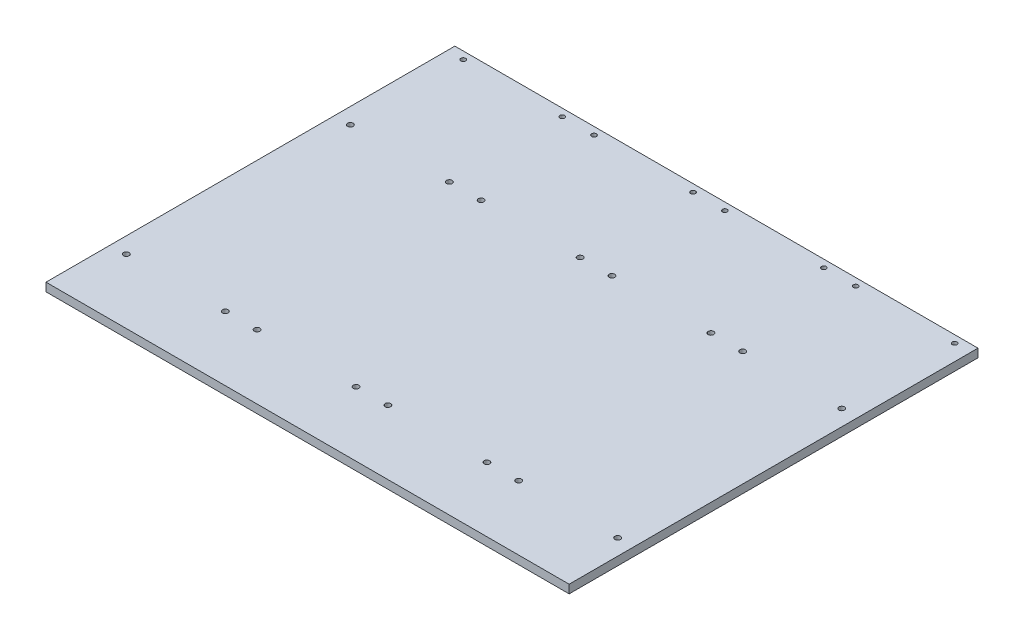
ISO-10303-21;
HEADER;
FILE_DESCRIPTION(('STEP AP214'),'2;1');
FILE_NAME('part.step','',(''),(''),'','','');
FILE_SCHEMA(('AUTOMOTIVE_DESIGN { 1 0 10303 214 1 1 1 1 }'));
ENDSEC;
DATA;
#1=APPLICATION_CONTEXT('core data for automotive mechanical design processes');
#2=APPLICATION_PROTOCOL_DEFINITION('international standard','automotive_design',2000,#1);
#3=PRODUCT_CONTEXT('',#1,'mechanical');
#4=PRODUCT('Part','Part','',(#3));
#5=PRODUCT_RELATED_PRODUCT_CATEGORY('part','',(#4));
#6=PRODUCT_DEFINITION_FORMATION('','',#4);
#7=PRODUCT_DEFINITION_CONTEXT('part definition',#1,'design');
#8=PRODUCT_DEFINITION('design','',#6,#7);
#9=PRODUCT_DEFINITION_SHAPE('','',#8);
#10=(LENGTH_UNIT() NAMED_UNIT(*) SI_UNIT(.MILLI.,.METRE.));
#11=(NAMED_UNIT(*) PLANE_ANGLE_UNIT() SI_UNIT($,.RADIAN.));
#12=(NAMED_UNIT(*) SI_UNIT($,.STERADIAN.) SOLID_ANGLE_UNIT());
#13=UNCERTAINTY_MEASURE_WITH_UNIT(LENGTH_MEASURE(1.E-05),#10,'distance_accuracy_value','');
#14=(GEOMETRIC_REPRESENTATION_CONTEXT(3) GLOBAL_UNCERTAINTY_ASSIGNED_CONTEXT((#13)) GLOBAL_UNIT_ASSIGNED_CONTEXT((#10,
#11,#12)) REPRESENTATION_CONTEXT('',''));
#15=CARTESIAN_POINT('',(0.,0.,0.));
#16=DIRECTION('',(0.,0.,1.));
#17=DIRECTION('',(1.,0.,0.));
#18=AXIS2_PLACEMENT_3D('',#15,#16,#17);
#19=CARTESIAN_POINT('',(0.,3.,72.997692486558));
#20=DIRECTION('',(0.,0.,-1.));
#21=DIRECTION('',(-1.,0.,0.));
#22=AXIS2_PLACEMENT_3D('',#19,#20,#21);
#23=PLANE('',#22);
#24=DIRECTION('',(1.,0.,0.));
#25=VECTOR('',#24,1.);
#26=CARTESIAN_POINT('',(0.,0.,72.997692486558));
#27=LINE('',#26,#25);
#28=CARTESIAN_POINT('',(-23.35,0.,72.997692486558));
#29=VERTEX_POINT('',#28);
#30=CARTESIAN_POINT('',(163.45,0.,72.997692486558));
#31=VERTEX_POINT('',#30);
#32=EDGE_CURVE('E171',#29,#31,#27,.T.);
#33=ORIENTED_EDGE('',*,*,#32,.T.);
#34=DIRECTION('',(0.,-1.,0.));
#35=VECTOR('',#34,1.);
#36=CARTESIAN_POINT('',(163.45,3.,72.997692486558));
#37=LINE('',#36,#35);
#38=CARTESIAN_POINT('',(163.45,3.,72.997692486558));
#39=VERTEX_POINT('',#38);
#40=EDGE_CURVE('E11',#39,#31,#37,.T.);
#41=ORIENTED_EDGE('',*,*,#40,.F.);
#42=DIRECTION('',(1.,0.,0.));
#43=VECTOR('',#42,1.);
#44=CARTESIAN_POINT('',(0.,3.,72.997692486558));
#45=LINE('',#44,#43);
#46=CARTESIAN_POINT('',(-23.35,3.,72.997692486558));
#47=VERTEX_POINT('',#46);
#48=EDGE_CURVE('E75',#47,#39,#45,.T.);
#49=ORIENTED_EDGE('',*,*,#48,.F.);
#50=DIRECTION('',(0.,-1.,0.));
#51=VECTOR('',#50,1.);
#52=CARTESIAN_POINT('',(-23.35,3.,72.997692486558));
#53=LINE('',#52,#51);
#54=EDGE_CURVE('E161',#47,#29,#53,.T.);
#55=ORIENTED_EDGE('',*,*,#54,.T.);
#56=EDGE_LOOP('',(#33,#41,#49,#55));
#57=FACE_BOUND('',#56,.T.);
#58=ADVANCED_FACE('F35',(#57),#23,.F.);
#59=CARTESIAN_POINT('',(163.45,3.,0.));
#60=DIRECTION('',(1.,0.,0.));
#61=DIRECTION('',(0.,0.,-1.));
#62=AXIS2_PLACEMENT_3D('',#59,#60,#61);
#63=PLANE('',#62);
#64=DIRECTION('',(0.,0.,1.));
#65=VECTOR('',#64,1.);
#66=CARTESIAN_POINT('',(163.45,0.,0.));
#67=LINE('',#66,#65);
#68=CARTESIAN_POINT('',(163.45,0.,-72.997692486558));
#69=VERTEX_POINT('',#68);
#70=EDGE_CURVE('E84',#69,#31,#67,.T.);
#71=ORIENTED_EDGE('',*,*,#70,.F.);
#72=DIRECTION('',(0.,-1.,0.));
#73=VECTOR('',#72,1.);
#74=CARTESIAN_POINT('',(163.45,3.,-72.997692486558));
#75=LINE('',#74,#73);
#76=CARTESIAN_POINT('',(163.45,3.,-72.997692486558));
#77=VERTEX_POINT('',#76);
#78=EDGE_CURVE('E44',#77,#69,#75,.T.);
#79=ORIENTED_EDGE('',*,*,#78,.F.);
#80=DIRECTION('',(0.,0.,1.));
#81=VECTOR('',#80,1.);
#82=CARTESIAN_POINT('',(163.45,3.,0.));
#83=LINE('',#82,#81);
#84=EDGE_CURVE('E82',#77,#39,#83,.T.);
#85=ORIENTED_EDGE('',*,*,#84,.T.);
#86=ORIENTED_EDGE('',*,*,#40,.T.);
#87=EDGE_LOOP('',(#71,#79,#85,#86));
#88=FACE_BOUND('',#87,.T.);
#89=ADVANCED_FACE('F81',(#88),#63,.T.);
#90=CARTESIAN_POINT('',(0.,3.,-72.997692486558));
#91=DIRECTION('',(0.,0.,-1.));
#92=DIRECTION('',(-1.,0.,0.));
#93=AXIS2_PLACEMENT_3D('',#90,#91,#92);
#94=PLANE('',#93);
#95=DIRECTION('',(1.,0.,0.));
#96=VECTOR('',#95,1.);
#97=CARTESIAN_POINT('',(0.,0.,-72.997692486558));
#98=LINE('',#97,#96);
#99=CARTESIAN_POINT('',(-23.35,0.,-72.997692486558));
#100=VERTEX_POINT('',#99);
#101=EDGE_CURVE('E175',#100,#69,#98,.T.);
#102=ORIENTED_EDGE('',*,*,#101,.F.);
#103=DIRECTION('',(0.,-1.,0.));
#104=VECTOR('',#103,1.);
#105=CARTESIAN_POINT('',(-23.35,3.,-72.997692486558));
#106=LINE('',#105,#104);
#107=CARTESIAN_POINT('',(-23.35,3.,-72.997692486558));
#108=VERTEX_POINT('',#107);
#109=EDGE_CURVE('E67',#108,#100,#106,.T.);
#110=ORIENTED_EDGE('',*,*,#109,.F.);
#111=DIRECTION('',(1.,0.,0.));
#112=VECTOR('',#111,1.);
#113=CARTESIAN_POINT('',(0.,3.,-72.997692486558));
#114=LINE('',#113,#112);
#115=EDGE_CURVE('E91',#108,#77,#114,.T.);
#116=ORIENTED_EDGE('',*,*,#115,.T.);
#117=ORIENTED_EDGE('',*,*,#78,.T.);
#118=EDGE_LOOP('',(#102,#110,#116,#117));
#119=FACE_BOUND('',#118,.T.);
#120=ADVANCED_FACE('F93',(#119),#94,.T.);
#121=CARTESIAN_POINT('',(157.775,3.,-30.002307513442));
#122=DIRECTION('',(0.,-1.,0.));
#123=DIRECTION('',(0.,0.,-1.));
#124=AXIS2_PLACEMENT_3D('',#121,#122,#123);
#125=CYLINDRICAL_SURFACE('',#124,0.999999999999998);
#126=CARTESIAN_POINT('',(157.775,3.,-30.002307513442));
#127=DIRECTION('',(0.,1.,0.));
#128=DIRECTION('',(0.,0.,1.));
#129=AXIS2_PLACEMENT_3D('',#126,#127,#128);
#130=CIRCLE('',#129,0.999999999999998);
#131=CARTESIAN_POINT('',(157.775,3.,-29.002307513442));
#132=VERTEX_POINT('',#131);
#133=EDGE_CURVE('E155',#132,#132,#130,.F.);
#134=ORIENTED_EDGE('',*,*,#133,.F.);
#135=EDGE_LOOP('',(#134));
#136=FACE_BOUND('',#135,.T.);
#137=CARTESIAN_POINT('',(157.775,0.,-30.002307513442));
#138=DIRECTION('',(0.,1.,0.));
#139=DIRECTION('',(0.,0.,1.));
#140=AXIS2_PLACEMENT_3D('',#137,#138,#139);
#141=CIRCLE('',#140,0.999999999999998);
#142=CARTESIAN_POINT('',(157.775,0.,-29.002307513442));
#143=VERTEX_POINT('',#142);
#144=EDGE_CURVE('E235',#143,#143,#141,.F.);
#145=ORIENTED_EDGE('',*,*,#144,.T.);
#146=EDGE_LOOP('',(#145));
#147=FACE_BOUND('',#146,.T.);
#148=ADVANCED_FACE('F570',(#136,#147),#125,.F.);
#149=CARTESIAN_POINT('',(122.425,3.,-30.002307513442));
#150=DIRECTION('',(0.,-1.,0.));
#151=DIRECTION('',(0.,0.,-1.));
#152=AXIS2_PLACEMENT_3D('',#149,#150,#151);
#153=CYLINDRICAL_SURFACE('',#152,0.999999999999998);
#154=CARTESIAN_POINT('',(122.425,3.,-30.002307513442));
#155=DIRECTION('',(0.,1.,0.));
#156=DIRECTION('',(0.,0.,1.));
#157=AXIS2_PLACEMENT_3D('',#154,#155,#156);
#158=CIRCLE('',#157,0.999999999999998);
#159=CARTESIAN_POINT('',(122.425,3.,-29.002307513442));
#160=VERTEX_POINT('',#159);
#161=EDGE_CURVE('E152',#160,#160,#158,.T.);
#162=ORIENTED_EDGE('',*,*,#161,.T.);
#163=EDGE_LOOP('',(#162));
#164=FACE_BOUND('',#163,.T.);
#165=CARTESIAN_POINT('',(122.425,0.,-30.002307513442));
#166=DIRECTION('',(0.,1.,0.));
#167=DIRECTION('',(0.,0.,1.));
#168=AXIS2_PLACEMENT_3D('',#165,#166,#167);
#169=CIRCLE('',#168,0.999999999999998);
#170=CARTESIAN_POINT('',(122.425,0.,-29.002307513442));
#171=VERTEX_POINT('',#170);
#172=EDGE_CURVE('E232',#171,#171,#169,.T.);
#173=ORIENTED_EDGE('',*,*,#172,.F.);
#174=EDGE_LOOP('',(#173));
#175=FACE_BOUND('',#174,.T.);
#176=ADVANCED_FACE('F561',(#164,#175),#153,.F.);
#177=CARTESIAN_POINT('',(122.425,3.,-70.322692486558));
#178=DIRECTION('',(0.,-1.,0.));
#179=DIRECTION('',(0.,0.,-1.));
#180=AXIS2_PLACEMENT_3D('',#177,#178,#179);
#181=CYLINDRICAL_SURFACE('',#180,0.849999999999994);
#182=CARTESIAN_POINT('',(122.425,3.,-70.322692486558));
#183=DIRECTION('',(0.,1.,0.));
#184=DIRECTION('',(0.,0.,1.));
#185=AXIS2_PLACEMENT_3D('',#182,#183,#184);
#186=CIRCLE('',#185,0.849999999999994);
#187=CARTESIAN_POINT('',(122.425,3.,-69.472692486558));
#188=VERTEX_POINT('',#187);
#189=EDGE_CURVE('E149',#188,#188,#186,.T.);
#190=ORIENTED_EDGE('',*,*,#189,.T.);
#191=EDGE_LOOP('',(#190));
#192=FACE_BOUND('',#191,.T.);
#193=CARTESIAN_POINT('',(122.425,0.,-70.322692486558));
#194=DIRECTION('',(0.,1.,0.));
#195=DIRECTION('',(0.,0.,1.));
#196=AXIS2_PLACEMENT_3D('',#193,#194,#195);
#197=CIRCLE('',#196,0.849999999999994);
#198=CARTESIAN_POINT('',(122.425,0.,-69.472692486558));
#199=VERTEX_POINT('',#198);
#200=EDGE_CURVE('E229',#199,#199,#197,.T.);
#201=ORIENTED_EDGE('',*,*,#200,.F.);
#202=EDGE_LOOP('',(#201));
#203=FACE_BOUND('',#202,.T.);
#204=ADVANCED_FACE('F552',(#192,#203),#181,.F.);
#205=CARTESIAN_POINT('',(157.775,3.,49.997692486558));
#206=DIRECTION('',(0.,-1.,0.));
#207=DIRECTION('',(0.,0.,-1.));
#208=AXIS2_PLACEMENT_3D('',#205,#206,#207);
#209=CYLINDRICAL_SURFACE('',#208,0.999999999999998);
#210=CARTESIAN_POINT('',(157.775,3.,49.997692486558));
#211=DIRECTION('',(0.,1.,0.));
#212=DIRECTION('',(0.,0.,1.));
#213=AXIS2_PLACEMENT_3D('',#210,#211,#212);
#214=CIRCLE('',#213,0.999999999999998);
#215=CARTESIAN_POINT('',(157.775,3.,50.9976924865581));
#216=VERTEX_POINT('',#215);
#217=EDGE_CURVE('E146',#216,#216,#214,.T.);
#218=ORIENTED_EDGE('',*,*,#217,.T.);
#219=EDGE_LOOP('',(#218));
#220=FACE_BOUND('',#219,.T.);
#221=CARTESIAN_POINT('',(157.775,0.,49.997692486558));
#222=DIRECTION('',(0.,1.,0.));
#223=DIRECTION('',(0.,0.,1.));
#224=AXIS2_PLACEMENT_3D('',#221,#222,#223);
#225=CIRCLE('',#224,0.999999999999998);
#226=CARTESIAN_POINT('',(157.775,0.,50.9976924865581));
#227=VERTEX_POINT('',#226);
#228=EDGE_CURVE('E226',#227,#227,#225,.T.);
#229=ORIENTED_EDGE('',*,*,#228,.F.);
#230=EDGE_LOOP('',(#229));
#231=FACE_BOUND('',#230,.T.);
#232=ADVANCED_FACE('F543',(#220,#231),#209,.F.);
#233=CARTESIAN_POINT('',(122.425,3.,49.997692486558));
#234=DIRECTION('',(0.,-1.,0.));
#235=DIRECTION('',(0.,0.,-1.));
#236=AXIS2_PLACEMENT_3D('',#233,#234,#235);
#237=CYLINDRICAL_SURFACE('',#236,0.999999999999998);
#238=CARTESIAN_POINT('',(122.425,3.,49.997692486558));
#239=DIRECTION('',(0.,1.,0.));
#240=DIRECTION('',(0.,0.,1.));
#241=AXIS2_PLACEMENT_3D('',#238,#239,#240);
#242=CIRCLE('',#241,0.999999999999998);
#243=CARTESIAN_POINT('',(122.425,3.,50.9976924865581));
#244=VERTEX_POINT('',#243);
#245=EDGE_CURVE('E143',#244,#244,#242,.F.);
#246=ORIENTED_EDGE('',*,*,#245,.F.);
#247=EDGE_LOOP('',(#246));
#248=FACE_BOUND('',#247,.T.);
#249=CARTESIAN_POINT('',(122.425,0.,49.997692486558));
#250=DIRECTION('',(0.,1.,0.));
#251=DIRECTION('',(0.,0.,1.));
#252=AXIS2_PLACEMENT_3D('',#249,#250,#251);
#253=CIRCLE('',#252,0.999999999999998);
#254=CARTESIAN_POINT('',(122.425,0.,50.9976924865581));
#255=VERTEX_POINT('',#254);
#256=EDGE_CURVE('E223',#255,#255,#253,.F.);
#257=ORIENTED_EDGE('',*,*,#256,.T.);
#258=EDGE_LOOP('',(#257));
#259=FACE_BOUND('',#258,.T.);
#260=ADVANCED_FACE('F534',(#248,#259),#237,.F.);
#261=CARTESIAN_POINT('',(111.075,3.,-70.322692486558));
#262=DIRECTION('',(0.,-1.,0.));
#263=DIRECTION('',(0.,0.,-1.));
#264=AXIS2_PLACEMENT_3D('',#261,#262,#263);
#265=CYLINDRICAL_SURFACE('',#264,0.849999999999994);
#266=CARTESIAN_POINT('',(111.075,3.,-70.322692486558));
#267=DIRECTION('',(0.,1.,0.));
#268=DIRECTION('',(0.,0.,1.));
#269=AXIS2_PLACEMENT_3D('',#266,#267,#268);
#270=CIRCLE('',#269,0.849999999999994);
#271=CARTESIAN_POINT('',(111.075,3.,-69.472692486558));
#272=VERTEX_POINT('',#271);
#273=EDGE_CURVE('E140',#272,#272,#270,.F.);
#274=ORIENTED_EDGE('',*,*,#273,.F.);
#275=EDGE_LOOP('',(#274));
#276=FACE_BOUND('',#275,.T.);
#277=CARTESIAN_POINT('',(111.075,0.,-70.322692486558));
#278=DIRECTION('',(0.,1.,0.));
#279=DIRECTION('',(0.,0.,1.));
#280=AXIS2_PLACEMENT_3D('',#277,#278,#279);
#281=CIRCLE('',#280,0.849999999999994);
#282=CARTESIAN_POINT('',(111.075,0.,-69.472692486558));
#283=VERTEX_POINT('',#282);
#284=EDGE_CURVE('E220',#283,#283,#281,.F.);
#285=ORIENTED_EDGE('',*,*,#284,.T.);
#286=EDGE_LOOP('',(#285));
#287=FACE_BOUND('',#286,.T.);
#288=ADVANCED_FACE('F525',(#276,#287),#265,.F.);
#289=CARTESIAN_POINT('',(111.075,3.,-30.002307513442));
#290=DIRECTION('',(0.,-1.,0.));
#291=DIRECTION('',(0.,0.,-1.));
#292=AXIS2_PLACEMENT_3D('',#289,#290,#291);
#293=CYLINDRICAL_SURFACE('',#292,0.999999999999998);
#294=CARTESIAN_POINT('',(111.075,3.,-30.002307513442));
#295=DIRECTION('',(0.,1.,0.));
#296=DIRECTION('',(0.,0.,1.));
#297=AXIS2_PLACEMENT_3D('',#294,#295,#296);
#298=CIRCLE('',#297,0.999999999999998);
#299=CARTESIAN_POINT('',(111.075,3.,-29.002307513442));
#300=VERTEX_POINT('',#299);
#301=EDGE_CURVE('E137',#300,#300,#298,.F.);
#302=ORIENTED_EDGE('',*,*,#301,.F.);
#303=EDGE_LOOP('',(#302));
#304=FACE_BOUND('',#303,.T.);
#305=CARTESIAN_POINT('',(111.075,0.,-30.002307513442));
#306=DIRECTION('',(0.,1.,0.));
#307=DIRECTION('',(0.,0.,1.));
#308=AXIS2_PLACEMENT_3D('',#305,#306,#307);
#309=CIRCLE('',#308,0.999999999999998);
#310=CARTESIAN_POINT('',(111.075,0.,-29.002307513442));
#311=VERTEX_POINT('',#310);
#312=EDGE_CURVE('E217',#311,#311,#309,.F.);
#313=ORIENTED_EDGE('',*,*,#312,.T.);
#314=EDGE_LOOP('',(#313));
#315=FACE_BOUND('',#314,.T.);
#316=ADVANCED_FACE('F516',(#304,#315),#293,.F.);
#317=CARTESIAN_POINT('',(75.725,3.,-30.002307513442));
#318=DIRECTION('',(0.,-1.,0.));
#319=DIRECTION('',(0.,0.,-1.));
#320=AXIS2_PLACEMENT_3D('',#317,#318,#319);
#321=CYLINDRICAL_SURFACE('',#320,0.999999999999998);
#322=CARTESIAN_POINT('',(75.725,3.,-30.002307513442));
#323=DIRECTION('',(0.,1.,0.));
#324=DIRECTION('',(0.,0.,1.));
#325=AXIS2_PLACEMENT_3D('',#322,#323,#324);
#326=CIRCLE('',#325,0.999999999999998);
#327=CARTESIAN_POINT('',(75.725,3.,-29.002307513442));
#328=VERTEX_POINT('',#327);
#329=EDGE_CURVE('E134',#328,#328,#326,.T.);
#330=ORIENTED_EDGE('',*,*,#329,.T.);
#331=EDGE_LOOP('',(#330));
#332=FACE_BOUND('',#331,.T.);
#333=CARTESIAN_POINT('',(75.725,0.,-30.002307513442));
#334=DIRECTION('',(0.,1.,0.));
#335=DIRECTION('',(0.,0.,1.));
#336=AXIS2_PLACEMENT_3D('',#333,#334,#335);
#337=CIRCLE('',#336,0.999999999999998);
#338=CARTESIAN_POINT('',(75.725,0.,-29.002307513442));
#339=VERTEX_POINT('',#338);
#340=EDGE_CURVE('E214',#339,#339,#337,.T.);
#341=ORIENTED_EDGE('',*,*,#340,.F.);
#342=EDGE_LOOP('',(#341));
#343=FACE_BOUND('',#342,.T.);
#344=ADVANCED_FACE('F507',(#332,#343),#321,.F.);
#345=CARTESIAN_POINT('',(75.725,3.,-70.322692486558));
#346=DIRECTION('',(0.,-1.,0.));
#347=DIRECTION('',(0.,0.,-1.));
#348=AXIS2_PLACEMENT_3D('',#345,#346,#347);
#349=CYLINDRICAL_SURFACE('',#348,0.849999999999994);
#350=CARTESIAN_POINT('',(75.725,3.,-70.322692486558));
#351=DIRECTION('',(0.,1.,0.));
#352=DIRECTION('',(0.,0.,1.));
#353=AXIS2_PLACEMENT_3D('',#350,#351,#352);
#354=CIRCLE('',#353,0.849999999999994);
#355=CARTESIAN_POINT('',(75.725,3.,-69.472692486558));
#356=VERTEX_POINT('',#355);
#357=EDGE_CURVE('E131',#356,#356,#354,.T.);
#358=ORIENTED_EDGE('',*,*,#357,.T.);
#359=EDGE_LOOP('',(#358));
#360=FACE_BOUND('',#359,.T.);
#361=CARTESIAN_POINT('',(75.725,0.,-70.322692486558));
#362=DIRECTION('',(0.,1.,0.));
#363=DIRECTION('',(0.,0.,1.));
#364=AXIS2_PLACEMENT_3D('',#361,#362,#363);
#365=CIRCLE('',#364,0.849999999999994);
#366=CARTESIAN_POINT('',(75.725,0.,-69.472692486558));
#367=VERTEX_POINT('',#366);
#368=EDGE_CURVE('E211',#367,#367,#365,.T.);
#369=ORIENTED_EDGE('',*,*,#368,.F.);
#370=EDGE_LOOP('',(#369));
#371=FACE_BOUND('',#370,.T.);
#372=ADVANCED_FACE('F498',(#360,#371),#349,.F.);
#373=CARTESIAN_POINT('',(111.075,3.,49.997692486558));
#374=DIRECTION('',(0.,-1.,0.));
#375=DIRECTION('',(0.,0.,-1.));
#376=AXIS2_PLACEMENT_3D('',#373,#374,#375);
#377=CYLINDRICAL_SURFACE('',#376,0.999999999999998);
#378=CARTESIAN_POINT('',(111.075,3.,49.997692486558));
#379=DIRECTION('',(0.,1.,0.));
#380=DIRECTION('',(0.,0.,1.));
#381=AXIS2_PLACEMENT_3D('',#378,#379,#380);
#382=CIRCLE('',#381,0.999999999999998);
#383=CARTESIAN_POINT('',(111.075,3.,50.9976924865581));
#384=VERTEX_POINT('',#383);
#385=EDGE_CURVE('E128',#384,#384,#382,.T.);
#386=ORIENTED_EDGE('',*,*,#385,.T.);
#387=EDGE_LOOP('',(#386));
#388=FACE_BOUND('',#387,.T.);
#389=CARTESIAN_POINT('',(111.075,0.,49.997692486558));
#390=DIRECTION('',(0.,1.,0.));
#391=DIRECTION('',(0.,0.,1.));
#392=AXIS2_PLACEMENT_3D('',#389,#390,#391);
#393=CIRCLE('',#392,0.999999999999998);
#394=CARTESIAN_POINT('',(111.075,0.,50.9976924865581));
#395=VERTEX_POINT('',#394);
#396=EDGE_CURVE('E208',#395,#395,#393,.T.);
#397=ORIENTED_EDGE('',*,*,#396,.F.);
#398=EDGE_LOOP('',(#397));
#399=FACE_BOUND('',#398,.T.);
#400=ADVANCED_FACE('F489',(#388,#399),#377,.F.);
#401=CARTESIAN_POINT('',(75.725,3.,49.997692486558));
#402=DIRECTION('',(0.,-1.,0.));
#403=DIRECTION('',(0.,0.,-1.));
#404=AXIS2_PLACEMENT_3D('',#401,#402,#403);
#405=CYLINDRICAL_SURFACE('',#404,0.999999999999998);
#406=CARTESIAN_POINT('',(75.725,3.,49.997692486558));
#407=DIRECTION('',(0.,1.,0.));
#408=DIRECTION('',(0.,0.,1.));
#409=AXIS2_PLACEMENT_3D('',#406,#407,#408);
#410=CIRCLE('',#409,0.999999999999998);
#411=CARTESIAN_POINT('',(75.725,3.,50.9976924865581));
#412=VERTEX_POINT('',#411);
#413=EDGE_CURVE('E125',#412,#412,#410,.F.);
#414=ORIENTED_EDGE('',*,*,#413,.F.);
#415=EDGE_LOOP('',(#414));
#416=FACE_BOUND('',#415,.T.);
#417=CARTESIAN_POINT('',(75.725,0.,49.997692486558));
#418=DIRECTION('',(0.,1.,0.));
#419=DIRECTION('',(0.,0.,1.));
#420=AXIS2_PLACEMENT_3D('',#417,#418,#419);
#421=CIRCLE('',#420,0.999999999999998);
#422=CARTESIAN_POINT('',(75.725,0.,50.9976924865581));
#423=VERTEX_POINT('',#422);
#424=EDGE_CURVE('E205',#423,#423,#421,.F.);
#425=ORIENTED_EDGE('',*,*,#424,.T.);
#426=EDGE_LOOP('',(#425));
#427=FACE_BOUND('',#426,.T.);
#428=ADVANCED_FACE('F480',(#416,#427),#405,.F.);
#429=CARTESIAN_POINT('',(64.375,3.,-70.322692486558));
#430=DIRECTION('',(0.,-1.,0.));
#431=DIRECTION('',(0.,0.,-1.));
#432=AXIS2_PLACEMENT_3D('',#429,#430,#431);
#433=CYLINDRICAL_SURFACE('',#432,0.849999999999994);
#434=CARTESIAN_POINT('',(64.375,3.,-70.322692486558));
#435=DIRECTION('',(0.,1.,0.));
#436=DIRECTION('',(0.,0.,1.));
#437=AXIS2_PLACEMENT_3D('',#434,#435,#436);
#438=CIRCLE('',#437,0.849999999999994);
#439=CARTESIAN_POINT('',(64.375,3.,-69.472692486558));
#440=VERTEX_POINT('',#439);
#441=EDGE_CURVE('E122',#440,#440,#438,.F.);
#442=ORIENTED_EDGE('',*,*,#441,.F.);
#443=EDGE_LOOP('',(#442));
#444=FACE_BOUND('',#443,.T.);
#445=CARTESIAN_POINT('',(64.375,0.,-70.322692486558));
#446=DIRECTION('',(0.,1.,0.));
#447=DIRECTION('',(0.,0.,1.));
#448=AXIS2_PLACEMENT_3D('',#445,#446,#447);
#449=CIRCLE('',#448,0.849999999999994);
#450=CARTESIAN_POINT('',(64.375,0.,-69.472692486558));
#451=VERTEX_POINT('',#450);
#452=EDGE_CURVE('E202',#451,#451,#449,.F.);
#453=ORIENTED_EDGE('',*,*,#452,.T.);
#454=EDGE_LOOP('',(#453));
#455=FACE_BOUND('',#454,.T.);
#456=ADVANCED_FACE('F471',(#444,#455),#433,.F.);
#457=CARTESIAN_POINT('',(64.375,3.,-30.002307513442));
#458=DIRECTION('',(0.,-1.,0.));
#459=DIRECTION('',(0.,0.,-1.));
#460=AXIS2_PLACEMENT_3D('',#457,#458,#459);
#461=CYLINDRICAL_SURFACE('',#460,0.999999999999998);
#462=CARTESIAN_POINT('',(64.375,3.,-30.002307513442));
#463=DIRECTION('',(0.,1.,0.));
#464=DIRECTION('',(0.,0.,1.));
#465=AXIS2_PLACEMENT_3D('',#462,#463,#464);
#466=CIRCLE('',#465,0.999999999999998);
#467=CARTESIAN_POINT('',(64.375,3.,-29.002307513442));
#468=VERTEX_POINT('',#467);
#469=EDGE_CURVE('E119',#468,#468,#466,.F.);
#470=ORIENTED_EDGE('',*,*,#469,.F.);
#471=EDGE_LOOP('',(#470));
#472=FACE_BOUND('',#471,.T.);
#473=CARTESIAN_POINT('',(64.375,0.,-30.002307513442));
#474=DIRECTION('',(0.,1.,0.));
#475=DIRECTION('',(0.,0.,1.));
#476=AXIS2_PLACEMENT_3D('',#473,#474,#475);
#477=CIRCLE('',#476,0.999999999999998);
#478=CARTESIAN_POINT('',(64.375,0.,-29.002307513442));
#479=VERTEX_POINT('',#478);
#480=EDGE_CURVE('E199',#479,#479,#477,.F.);
#481=ORIENTED_EDGE('',*,*,#480,.T.);
#482=EDGE_LOOP('',(#481));
#483=FACE_BOUND('',#482,.T.);
#484=ADVANCED_FACE('F462',(#472,#483),#461,.F.);
#485=CARTESIAN_POINT('',(29.025,3.,-30.002307513442));
#486=DIRECTION('',(0.,-1.,0.));
#487=DIRECTION('',(0.,0.,-1.));
#488=AXIS2_PLACEMENT_3D('',#485,#486,#487);
#489=CYLINDRICAL_SURFACE('',#488,1.00000000000001);
#490=CARTESIAN_POINT('',(29.025,3.,-30.002307513442));
#491=DIRECTION('',(0.,1.,0.));
#492=DIRECTION('',(0.,0.,1.));
#493=AXIS2_PLACEMENT_3D('',#490,#491,#492);
#494=CIRCLE('',#493,1.00000000000001);
#495=CARTESIAN_POINT('',(29.025,3.,-29.0023075134419));
#496=VERTEX_POINT('',#495);
#497=EDGE_CURVE('E116',#496,#496,#494,.T.);
#498=ORIENTED_EDGE('',*,*,#497,.T.);
#499=EDGE_LOOP('',(#498));
#500=FACE_BOUND('',#499,.T.);
#501=CARTESIAN_POINT('',(29.025,0.,-30.002307513442));
#502=DIRECTION('',(0.,1.,0.));
#503=DIRECTION('',(0.,0.,1.));
#504=AXIS2_PLACEMENT_3D('',#501,#502,#503);
#505=CIRCLE('',#504,1.00000000000001);
#506=CARTESIAN_POINT('',(29.025,0.,-29.0023075134419));
#507=VERTEX_POINT('',#506);
#508=EDGE_CURVE('E196',#507,#507,#505,.T.);
#509=ORIENTED_EDGE('',*,*,#508,.F.);
#510=EDGE_LOOP('',(#509));
#511=FACE_BOUND('',#510,.T.);
#512=ADVANCED_FACE('F453',(#500,#511),#489,.F.);
#513=CARTESIAN_POINT('',(29.025,3.,-70.322692486558));
#514=DIRECTION('',(0.,-1.,0.));
#515=DIRECTION('',(0.,0.,-1.));
#516=AXIS2_PLACEMENT_3D('',#513,#514,#515);
#517=CYLINDRICAL_SURFACE('',#516,0.850000000000001);
#518=CARTESIAN_POINT('',(29.025,3.,-70.322692486558));
#519=DIRECTION('',(0.,1.,0.));
#520=DIRECTION('',(0.,0.,1.));
#521=AXIS2_PLACEMENT_3D('',#518,#519,#520);
#522=CIRCLE('',#521,0.850000000000001);
#523=CARTESIAN_POINT('',(29.025,3.,-69.472692486558));
#524=VERTEX_POINT('',#523);
#525=EDGE_CURVE('E113',#524,#524,#522,.T.);
#526=ORIENTED_EDGE('',*,*,#525,.T.);
#527=EDGE_LOOP('',(#526));
#528=FACE_BOUND('',#527,.T.);
#529=CARTESIAN_POINT('',(29.025,0.,-70.322692486558));
#530=DIRECTION('',(0.,1.,0.));
#531=DIRECTION('',(0.,0.,1.));
#532=AXIS2_PLACEMENT_3D('',#529,#530,#531);
#533=CIRCLE('',#532,0.850000000000001);
#534=CARTESIAN_POINT('',(29.025,0.,-69.472692486558));
#535=VERTEX_POINT('',#534);
#536=EDGE_CURVE('E193',#535,#535,#533,.T.);
#537=ORIENTED_EDGE('',*,*,#536,.F.);
#538=EDGE_LOOP('',(#537));
#539=FACE_BOUND('',#538,.T.);
#540=ADVANCED_FACE('F444',(#528,#539),#517,.F.);
#541=CARTESIAN_POINT('',(64.375,3.,49.997692486558));
#542=DIRECTION('',(0.,-1.,0.));
#543=DIRECTION('',(0.,0.,-1.));
#544=AXIS2_PLACEMENT_3D('',#541,#542,#543);
#545=CYLINDRICAL_SURFACE('',#544,0.999999999999998);
#546=CARTESIAN_POINT('',(64.375,3.,49.997692486558));
#547=DIRECTION('',(0.,1.,0.));
#548=DIRECTION('',(0.,0.,1.));
#549=AXIS2_PLACEMENT_3D('',#546,#547,#548);
#550=CIRCLE('',#549,0.999999999999998);
#551=CARTESIAN_POINT('',(64.375,3.,50.9976924865581));
#552=VERTEX_POINT('',#551);
#553=EDGE_CURVE('E110',#552,#552,#550,.T.);
#554=ORIENTED_EDGE('',*,*,#553,.T.);
#555=EDGE_LOOP('',(#554));
#556=FACE_BOUND('',#555,.T.);
#557=CARTESIAN_POINT('',(64.375,0.,49.997692486558));
#558=DIRECTION('',(0.,1.,0.));
#559=DIRECTION('',(0.,0.,1.));
#560=AXIS2_PLACEMENT_3D('',#557,#558,#559);
#561=CIRCLE('',#560,0.999999999999998);
#562=CARTESIAN_POINT('',(64.375,0.,50.9976924865581));
#563=VERTEX_POINT('',#562);
#564=EDGE_CURVE('E190',#563,#563,#561,.T.);
#565=ORIENTED_EDGE('',*,*,#564,.F.);
#566=EDGE_LOOP('',(#565));
#567=FACE_BOUND('',#566,.T.);
#568=ADVANCED_FACE('F435',(#556,#567),#545,.F.);
#569=CARTESIAN_POINT('',(29.025,3.,49.997692486558));
#570=DIRECTION('',(0.,-1.,0.));
#571=DIRECTION('',(0.,0.,-1.));
#572=AXIS2_PLACEMENT_3D('',#569,#570,#571);
#573=CYLINDRICAL_SURFACE('',#572,1.00000000000001);
#574=CARTESIAN_POINT('',(29.025,3.,49.997692486558));
#575=DIRECTION('',(0.,1.,0.));
#576=DIRECTION('',(0.,0.,1.));
#577=AXIS2_PLACEMENT_3D('',#574,#575,#576);
#578=CIRCLE('',#577,1.00000000000001);
#579=CARTESIAN_POINT('',(29.025,3.,50.9976924865581));
#580=VERTEX_POINT('',#579);
#581=EDGE_CURVE('E107',#580,#580,#578,.F.);
#582=ORIENTED_EDGE('',*,*,#581,.F.);
#583=EDGE_LOOP('',(#582));
#584=FACE_BOUND('',#583,.T.);
#585=CARTESIAN_POINT('',(29.025,0.,49.997692486558));
#586=DIRECTION('',(0.,1.,0.));
#587=DIRECTION('',(0.,0.,1.));
#588=AXIS2_PLACEMENT_3D('',#585,#586,#587);
#589=CIRCLE('',#588,1.00000000000001);
#590=CARTESIAN_POINT('',(29.025,0.,50.9976924865581));
#591=VERTEX_POINT('',#590);
#592=EDGE_CURVE('E187',#591,#591,#589,.F.);
#593=ORIENTED_EDGE('',*,*,#592,.T.);
#594=EDGE_LOOP('',(#593));
#595=FACE_BOUND('',#594,.T.);
#596=ADVANCED_FACE('F426',(#584,#595),#573,.F.);
#597=CARTESIAN_POINT('',(17.675,3.,-70.322692486558));
#598=DIRECTION('',(0.,-1.,0.));
#599=DIRECTION('',(0.,0.,-1.));
#600=AXIS2_PLACEMENT_3D('',#597,#598,#599);
#601=CYLINDRICAL_SURFACE('',#600,0.850000000000001);
#602=CARTESIAN_POINT('',(17.675,3.,-70.322692486558));
#603=DIRECTION('',(0.,1.,0.));
#604=DIRECTION('',(0.,0.,1.));
#605=AXIS2_PLACEMENT_3D('',#602,#603,#604);
#606=CIRCLE('',#605,0.850000000000001);
#607=CARTESIAN_POINT('',(17.675,3.,-69.472692486558));
#608=VERTEX_POINT('',#607);
#609=EDGE_CURVE('E104',#608,#608,#606,.F.);
#610=ORIENTED_EDGE('',*,*,#609,.F.);
#611=EDGE_LOOP('',(#610));
#612=FACE_BOUND('',#611,.T.);
#613=CARTESIAN_POINT('',(17.675,0.,-70.322692486558));
#614=DIRECTION('',(0.,1.,0.));
#615=DIRECTION('',(0.,0.,1.));
#616=AXIS2_PLACEMENT_3D('',#613,#614,#615);
#617=CIRCLE('',#616,0.850000000000001);
#618=CARTESIAN_POINT('',(17.675,0.,-69.472692486558));
#619=VERTEX_POINT('',#618);
#620=EDGE_CURVE('E184',#619,#619,#617,.F.);
#621=ORIENTED_EDGE('',*,*,#620,.T.);
#622=EDGE_LOOP('',(#621));
#623=FACE_BOUND('',#622,.T.);
#624=ADVANCED_FACE('F417',(#612,#623),#601,.F.);
#625=CARTESIAN_POINT('',(17.675,3.,-30.002307513442));
#626=DIRECTION('',(0.,-1.,0.));
#627=DIRECTION('',(0.,0.,-1.));
#628=AXIS2_PLACEMENT_3D('',#625,#626,#627);
#629=CYLINDRICAL_SURFACE('',#628,1.);
#630=CARTESIAN_POINT('',(17.675,3.,-30.002307513442));
#631=DIRECTION('',(0.,1.,0.));
#632=DIRECTION('',(0.,0.,1.));
#633=AXIS2_PLACEMENT_3D('',#630,#631,#632);
#634=CIRCLE('',#633,1.);
#635=CARTESIAN_POINT('',(17.675,3.,-29.002307513442));
#636=VERTEX_POINT('',#635);
#637=EDGE_CURVE('E101',#636,#636,#634,.F.);
#638=ORIENTED_EDGE('',*,*,#637,.F.);
#639=EDGE_LOOP('',(#638));
#640=FACE_BOUND('',#639,.T.);
#641=CARTESIAN_POINT('',(17.675,0.,-30.002307513442));
#642=DIRECTION('',(0.,1.,0.));
#643=DIRECTION('',(0.,0.,1.));
#644=AXIS2_PLACEMENT_3D('',#641,#642,#643);
#645=CIRCLE('',#644,1.);
#646=CARTESIAN_POINT('',(17.675,0.,-29.002307513442));
#647=VERTEX_POINT('',#646);
#648=EDGE_CURVE('E181',#647,#647,#645,.F.);
#649=ORIENTED_EDGE('',*,*,#648,.T.);
#650=EDGE_LOOP('',(#649));
#651=FACE_BOUND('',#650,.T.);
#652=ADVANCED_FACE('F408',(#640,#651),#629,.F.);
#653=CARTESIAN_POINT('',(-17.675,3.,-30.002307513442));
#654=DIRECTION('',(0.,-1.,0.));
#655=DIRECTION('',(0.,0.,-1.));
#656=AXIS2_PLACEMENT_3D('',#653,#654,#655);
#657=CYLINDRICAL_SURFACE('',#656,1.00000000000001);
#658=CARTESIAN_POINT('',(-17.675,3.,-30.002307513442));
#659=DIRECTION('',(0.,1.,0.));
#660=DIRECTION('',(0.,0.,1.));
#661=AXIS2_PLACEMENT_3D('',#658,#659,#660);
#662=CIRCLE('',#661,1.00000000000001);
#663=CARTESIAN_POINT('',(-17.675,3.,-29.0023075134419));
#664=VERTEX_POINT('',#663);
#665=EDGE_CURVE('E95',#664,#664,#662,.T.);
#666=ORIENTED_EDGE('',*,*,#665,.T.);
#667=EDGE_LOOP('',(#666));
#668=FACE_BOUND('',#667,.T.);
#669=CARTESIAN_POINT('',(-17.675,0.,-30.002307513442));
#670=DIRECTION('',(0.,1.,0.));
#671=DIRECTION('',(0.,0.,1.));
#672=AXIS2_PLACEMENT_3D('',#669,#670,#671);
#673=CIRCLE('',#672,1.00000000000001);
#674=CARTESIAN_POINT('',(-17.675,0.,-29.0023075134419));
#675=VERTEX_POINT('',#674);
#676=EDGE_CURVE('E178',#675,#675,#673,.T.);
#677=ORIENTED_EDGE('',*,*,#676,.F.);
#678=EDGE_LOOP('',(#677));
#679=FACE_BOUND('',#678,.T.);
#680=ADVANCED_FACE('F400',(#668,#679),#657,.F.);
#681=CARTESIAN_POINT('',(-23.35,3.,0.));
#682=DIRECTION('',(1.,0.,0.));
#683=DIRECTION('',(0.,0.,-1.));
#684=AXIS2_PLACEMENT_3D('',#681,#682,#683);
#685=PLANE('',#684);
#686=DIRECTION('',(0.,0.,1.));
#687=VECTOR('',#686,1.);
#688=CARTESIAN_POINT('',(-23.35,0.,0.));
#689=LINE('',#688,#687);
#690=EDGE_CURVE('E70',#100,#29,#689,.T.);
#691=ORIENTED_EDGE('',*,*,#690,.T.);
#692=ORIENTED_EDGE('',*,*,#54,.F.);
#693=DIRECTION('',(0.,0.,1.));
#694=VECTOR('',#693,1.);
#695=CARTESIAN_POINT('',(-23.35,3.,0.));
#696=LINE('',#695,#694);
#697=EDGE_CURVE('E52',#108,#47,#696,.T.);
#698=ORIENTED_EDGE('',*,*,#697,.F.);
#699=ORIENTED_EDGE('',*,*,#109,.T.);
#700=EDGE_LOOP('',(#691,#692,#698,#699));
#701=FACE_BOUND('',#700,.T.);
#702=ADVANCED_FACE('F317',(#701),#685,.F.);
#703=CARTESIAN_POINT('',(-17.675,3.,-70.322692486558));
#704=DIRECTION('',(0.,-1.,0.));
#705=DIRECTION('',(0.,0.,-1.));
#706=AXIS2_PLACEMENT_3D('',#703,#704,#705);
#707=CYLINDRICAL_SURFACE('',#706,0.850000000000001);
#708=CARTESIAN_POINT('',(-17.675,3.,-70.322692486558));
#709=DIRECTION('',(0.,1.,0.));
#710=DIRECTION('',(0.,0.,1.));
#711=AXIS2_PLACEMENT_3D('',#708,#709,#710);
#712=CIRCLE('',#711,0.850000000000001);
#713=CARTESIAN_POINT('',(-17.675,3.,-69.472692486558));
#714=VERTEX_POINT('',#713);
#715=EDGE_CURVE('E333',#714,#714,#712,.T.);
#716=ORIENTED_EDGE('',*,*,#715,.T.);
#717=EDGE_LOOP('',(#716));
#718=FACE_BOUND('',#717,.T.);
#719=CARTESIAN_POINT('',(-17.675,0.,-70.322692486558));
#720=DIRECTION('',(0.,1.,0.));
#721=DIRECTION('',(0.,0.,1.));
#722=AXIS2_PLACEMENT_3D('',#719,#720,#721);
#723=CIRCLE('',#722,0.850000000000001);
#724=CARTESIAN_POINT('',(-17.675,0.,-69.472692486558));
#725=VERTEX_POINT('',#724);
#726=EDGE_CURVE('E168',#725,#725,#723,.T.);
#727=ORIENTED_EDGE('',*,*,#726,.F.);
#728=EDGE_LOOP('',(#727));
#729=FACE_BOUND('',#728,.T.);
#730=ADVANCED_FACE('F315',(#718,#729),#707,.F.);
#731=CARTESIAN_POINT('',(17.675,3.,49.997692486558));
#732=DIRECTION('',(0.,-1.,0.));
#733=DIRECTION('',(0.,0.,-1.));
#734=AXIS2_PLACEMENT_3D('',#731,#732,#733);
#735=CYLINDRICAL_SURFACE('',#734,1.);
#736=CARTESIAN_POINT('',(17.675,3.,49.997692486558));
#737=DIRECTION('',(0.,1.,0.));
#738=DIRECTION('',(0.,0.,1.));
#739=AXIS2_PLACEMENT_3D('',#736,#737,#738);
#740=CIRCLE('',#739,1.);
#741=CARTESIAN_POINT('',(17.675,3.,50.9976924865581));
#742=VERTEX_POINT('',#741);
#743=EDGE_CURVE('E326',#742,#742,#740,.T.);
#744=ORIENTED_EDGE('',*,*,#743,.T.);
#745=EDGE_LOOP('',(#744));
#746=FACE_BOUND('',#745,.T.);
#747=CARTESIAN_POINT('',(17.675,0.,49.997692486558));
#748=DIRECTION('',(0.,1.,0.));
#749=DIRECTION('',(0.,0.,1.));
#750=AXIS2_PLACEMENT_3D('',#747,#748,#749);
#751=CIRCLE('',#750,1.);
#752=CARTESIAN_POINT('',(17.675,0.,50.9976924865581));
#753=VERTEX_POINT('',#752);
#754=EDGE_CURVE('E165',#753,#753,#751,.T.);
#755=ORIENTED_EDGE('',*,*,#754,.F.);
#756=EDGE_LOOP('',(#755));
#757=FACE_BOUND('',#756,.T.);
#758=ADVANCED_FACE('F303',(#746,#757),#735,.F.);
#759=CARTESIAN_POINT('',(-17.675,3.,49.997692486558));
#760=DIRECTION('',(0.,-1.,0.));
#761=DIRECTION('',(0.,0.,-1.));
#762=AXIS2_PLACEMENT_3D('',#759,#760,#761);
#763=CYLINDRICAL_SURFACE('',#762,1.00000000000001);
#764=CARTESIAN_POINT('',(-17.675,3.,49.997692486558));
#765=DIRECTION('',(0.,1.,0.));
#766=DIRECTION('',(0.,0.,1.));
#767=AXIS2_PLACEMENT_3D('',#764,#765,#766);
#768=CIRCLE('',#767,1.00000000000001);
#769=CARTESIAN_POINT('',(-17.675,3.,50.9976924865581));
#770=VERTEX_POINT('',#769);
#771=EDGE_CURVE('E241',#770,#770,#768,.F.);
#772=ORIENTED_EDGE('',*,*,#771,.F.);
#773=EDGE_LOOP('',(#772));
#774=FACE_BOUND('',#773,.T.);
#775=CARTESIAN_POINT('',(-17.675,0.,49.997692486558));
#776=DIRECTION('',(0.,1.,0.));
#777=DIRECTION('',(0.,0.,1.));
#778=AXIS2_PLACEMENT_3D('',#775,#776,#777);
#779=CIRCLE('',#778,1.00000000000001);
#780=CARTESIAN_POINT('',(-17.675,0.,50.9976924865581));
#781=VERTEX_POINT('',#780);
#782=EDGE_CURVE('E162',#781,#781,#779,.F.);
#783=ORIENTED_EDGE('',*,*,#782,.T.);
#784=EDGE_LOOP('',(#783));
#785=FACE_BOUND('',#784,.T.);
#786=ADVANCED_FACE('F37',(#774,#785),#763,.F.);
#787=CARTESIAN_POINT('',(157.775,3.,-70.322692486558));
#788=DIRECTION('',(0.,-1.,0.));
#789=DIRECTION('',(0.,0.,-1.));
#790=AXIS2_PLACEMENT_3D('',#787,#788,#789);
#791=CYLINDRICAL_SURFACE('',#790,0.850000000000007);
#792=CARTESIAN_POINT('',(157.775,3.,-70.322692486558));
#793=DIRECTION('',(0.,1.,0.));
#794=DIRECTION('',(0.,0.,1.));
#795=AXIS2_PLACEMENT_3D('',#792,#793,#794);
#796=CIRCLE('',#795,0.850000000000007);
#797=CARTESIAN_POINT('',(157.775,3.,-69.472692486558));
#798=VERTEX_POINT('',#797);
#799=EDGE_CURVE('E158',#798,#798,#796,.F.);
#800=ORIENTED_EDGE('',*,*,#799,.F.);
#801=EDGE_LOOP('',(#800));
#802=FACE_BOUND('',#801,.T.);
#803=CARTESIAN_POINT('',(157.775,0.,-70.322692486558));
#804=DIRECTION('',(0.,1.,0.));
#805=DIRECTION('',(0.,0.,1.));
#806=AXIS2_PLACEMENT_3D('',#803,#804,#805);
#807=CIRCLE('',#806,0.850000000000007);
#808=CARTESIAN_POINT('',(157.775,0.,-69.472692486558));
#809=VERTEX_POINT('',#808);
#810=EDGE_CURVE('E238',#809,#809,#807,.F.);
#811=ORIENTED_EDGE('',*,*,#810,.T.);
#812=EDGE_LOOP('',(#811));
#813=FACE_BOUND('',#812,.T.);
#814=ADVANCED_FACE('F293',(#802,#813),#791,.F.);
#815=CARTESIAN_POINT('',(0.,3.,0.));
#816=DIRECTION('',(0.,1.,0.));
#817=DIRECTION('',(0.,0.,1.));
#818=AXIS2_PLACEMENT_3D('',#815,#816,#817);
#819=PLANE('',#818);
#820=ORIENTED_EDGE('',*,*,#771,.T.);
#821=EDGE_LOOP('',(#820));
#822=FACE_BOUND('',#821,.T.);
#823=ORIENTED_EDGE('',*,*,#743,.F.);
#824=EDGE_LOOP('',(#823));
#825=FACE_BOUND('',#824,.T.);
#826=ORIENTED_EDGE('',*,*,#715,.F.);
#827=EDGE_LOOP('',(#826));
#828=FACE_BOUND('',#827,.T.);
#829=ORIENTED_EDGE('',*,*,#48,.T.);
#830=ORIENTED_EDGE('',*,*,#84,.F.);
#831=ORIENTED_EDGE('',*,*,#115,.F.);
#832=ORIENTED_EDGE('',*,*,#697,.T.);
#833=EDGE_LOOP('',(#829,#830,#831,#832));
#834=FACE_BOUND('',#833,.T.);
#835=ORIENTED_EDGE('',*,*,#665,.F.);
#836=EDGE_LOOP('',(#835));
#837=FACE_BOUND('',#836,.T.);
#838=ORIENTED_EDGE('',*,*,#637,.T.);
#839=EDGE_LOOP('',(#838));
#840=FACE_BOUND('',#839,.T.);
#841=ORIENTED_EDGE('',*,*,#609,.T.);
#842=EDGE_LOOP('',(#841));
#843=FACE_BOUND('',#842,.T.);
#844=ORIENTED_EDGE('',*,*,#581,.T.);
#845=EDGE_LOOP('',(#844));
#846=FACE_BOUND('',#845,.T.);
#847=ORIENTED_EDGE('',*,*,#553,.F.);
#848=EDGE_LOOP('',(#847));
#849=FACE_BOUND('',#848,.T.);
#850=ORIENTED_EDGE('',*,*,#525,.F.);
#851=EDGE_LOOP('',(#850));
#852=FACE_BOUND('',#851,.T.);
#853=ORIENTED_EDGE('',*,*,#497,.F.);
#854=EDGE_LOOP('',(#853));
#855=FACE_BOUND('',#854,.T.);
#856=ORIENTED_EDGE('',*,*,#469,.T.);
#857=EDGE_LOOP('',(#856));
#858=FACE_BOUND('',#857,.T.);
#859=ORIENTED_EDGE('',*,*,#441,.T.);
#860=EDGE_LOOP('',(#859));
#861=FACE_BOUND('',#860,.T.);
#862=ORIENTED_EDGE('',*,*,#413,.T.);
#863=EDGE_LOOP('',(#862));
#864=FACE_BOUND('',#863,.T.);
#865=ORIENTED_EDGE('',*,*,#385,.F.);
#866=EDGE_LOOP('',(#865));
#867=FACE_BOUND('',#866,.T.);
#868=ORIENTED_EDGE('',*,*,#357,.F.);
#869=EDGE_LOOP('',(#868));
#870=FACE_BOUND('',#869,.T.);
#871=ORIENTED_EDGE('',*,*,#329,.F.);
#872=EDGE_LOOP('',(#871));
#873=FACE_BOUND('',#872,.T.);
#874=ORIENTED_EDGE('',*,*,#301,.T.);
#875=EDGE_LOOP('',(#874));
#876=FACE_BOUND('',#875,.T.);
#877=ORIENTED_EDGE('',*,*,#273,.T.);
#878=EDGE_LOOP('',(#877));
#879=FACE_BOUND('',#878,.T.);
#880=ORIENTED_EDGE('',*,*,#245,.T.);
#881=EDGE_LOOP('',(#880));
#882=FACE_BOUND('',#881,.T.);
#883=ORIENTED_EDGE('',*,*,#217,.F.);
#884=EDGE_LOOP('',(#883));
#885=FACE_BOUND('',#884,.T.);
#886=ORIENTED_EDGE('',*,*,#189,.F.);
#887=EDGE_LOOP('',(#886));
#888=FACE_BOUND('',#887,.T.);
#889=ORIENTED_EDGE('',*,*,#161,.F.);
#890=EDGE_LOOP('',(#889));
#891=FACE_BOUND('',#890,.T.);
#892=ORIENTED_EDGE('',*,*,#133,.T.);
#893=EDGE_LOOP('',(#892));
#894=FACE_BOUND('',#893,.T.);
#895=ORIENTED_EDGE('',*,*,#799,.T.);
#896=EDGE_LOOP('',(#895));
#897=FACE_BOUND('',#896,.T.);
#898=ADVANCED_FACE('F89',(#822,#825,#828,#834,#837,#840,#843,#846,#849,#852,#855,#858,#861,#864,
#867,#870,#873,#876,#879,#882,#885,#888,#891,#894,#897),#819,.T.);
#899=CARTESIAN_POINT('',(0.,0.,0.));
#900=DIRECTION('',(0.,1.,0.));
#901=DIRECTION('',(0.,0.,1.));
#902=AXIS2_PLACEMENT_3D('',#899,#900,#901);
#903=PLANE('',#902);
#904=ORIENTED_EDGE('',*,*,#782,.F.);
#905=EDGE_LOOP('',(#904));
#906=FACE_BOUND('',#905,.T.);
#907=ORIENTED_EDGE('',*,*,#754,.T.);
#908=EDGE_LOOP('',(#907));
#909=FACE_BOUND('',#908,.T.);
#910=ORIENTED_EDGE('',*,*,#726,.T.);
#911=EDGE_LOOP('',(#910));
#912=FACE_BOUND('',#911,.T.);
#913=ORIENTED_EDGE('',*,*,#32,.F.);
#914=ORIENTED_EDGE('',*,*,#690,.F.);
#915=ORIENTED_EDGE('',*,*,#101,.T.);
#916=ORIENTED_EDGE('',*,*,#70,.T.);
#917=EDGE_LOOP('',(#913,#914,#915,#916));
#918=FACE_BOUND('',#917,.T.);
#919=ORIENTED_EDGE('',*,*,#676,.T.);
#920=EDGE_LOOP('',(#919));
#921=FACE_BOUND('',#920,.T.);
#922=ORIENTED_EDGE('',*,*,#648,.F.);
#923=EDGE_LOOP('',(#922));
#924=FACE_BOUND('',#923,.T.);
#925=ORIENTED_EDGE('',*,*,#620,.F.);
#926=EDGE_LOOP('',(#925));
#927=FACE_BOUND('',#926,.T.);
#928=ORIENTED_EDGE('',*,*,#592,.F.);
#929=EDGE_LOOP('',(#928));
#930=FACE_BOUND('',#929,.T.);
#931=ORIENTED_EDGE('',*,*,#564,.T.);
#932=EDGE_LOOP('',(#931));
#933=FACE_BOUND('',#932,.T.);
#934=ORIENTED_EDGE('',*,*,#536,.T.);
#935=EDGE_LOOP('',(#934));
#936=FACE_BOUND('',#935,.T.);
#937=ORIENTED_EDGE('',*,*,#508,.T.);
#938=EDGE_LOOP('',(#937));
#939=FACE_BOUND('',#938,.T.);
#940=ORIENTED_EDGE('',*,*,#480,.F.);
#941=EDGE_LOOP('',(#940));
#942=FACE_BOUND('',#941,.T.);
#943=ORIENTED_EDGE('',*,*,#452,.F.);
#944=EDGE_LOOP('',(#943));
#945=FACE_BOUND('',#944,.T.);
#946=ORIENTED_EDGE('',*,*,#424,.F.);
#947=EDGE_LOOP('',(#946));
#948=FACE_BOUND('',#947,.T.);
#949=ORIENTED_EDGE('',*,*,#396,.T.);
#950=EDGE_LOOP('',(#949));
#951=FACE_BOUND('',#950,.T.);
#952=ORIENTED_EDGE('',*,*,#368,.T.);
#953=EDGE_LOOP('',(#952));
#954=FACE_BOUND('',#953,.T.);
#955=ORIENTED_EDGE('',*,*,#340,.T.);
#956=EDGE_LOOP('',(#955));
#957=FACE_BOUND('',#956,.T.);
#958=ORIENTED_EDGE('',*,*,#312,.F.);
#959=EDGE_LOOP('',(#958));
#960=FACE_BOUND('',#959,.T.);
#961=ORIENTED_EDGE('',*,*,#284,.F.);
#962=EDGE_LOOP('',(#961));
#963=FACE_BOUND('',#962,.T.);
#964=ORIENTED_EDGE('',*,*,#256,.F.);
#965=EDGE_LOOP('',(#964));
#966=FACE_BOUND('',#965,.T.);
#967=ORIENTED_EDGE('',*,*,#228,.T.);
#968=EDGE_LOOP('',(#967));
#969=FACE_BOUND('',#968,.T.);
#970=ORIENTED_EDGE('',*,*,#200,.T.);
#971=EDGE_LOOP('',(#970));
#972=FACE_BOUND('',#971,.T.);
#973=ORIENTED_EDGE('',*,*,#172,.T.);
#974=EDGE_LOOP('',(#973));
#975=FACE_BOUND('',#974,.T.);
#976=ORIENTED_EDGE('',*,*,#144,.F.);
#977=EDGE_LOOP('',(#976));
#978=FACE_BOUND('',#977,.T.);
#979=ORIENTED_EDGE('',*,*,#810,.F.);
#980=EDGE_LOOP('',(#979));
#981=FACE_BOUND('',#980,.T.);
#982=ADVANCED_FACE('F246',(#906,#909,#912,#918,#921,#924,#927,#930,#933,#936,#939,#942,#945,
#948,#951,#954,#957,#960,#963,#966,#969,#972,#975,#978,#981),#903,.F.);
#983=CLOSED_SHELL('',(#58,#89,#120,#148,#176,#204,#232,#260,#288,#316,#344,#372,#400,#428,#456,
#484,#512,#540,#568,#596,#624,#652,#680,#702,#730,#758,#786,#814,#898,#982));
#984=MANIFOLD_SOLID_BREP('B2',#983);
#985=ADVANCED_BREP_SHAPE_REPRESENTATION('',(#18,#984),#14);
#986=SHAPE_DEFINITION_REPRESENTATION(#9,#985);
ENDSEC;
END-ISO-10303-21;
